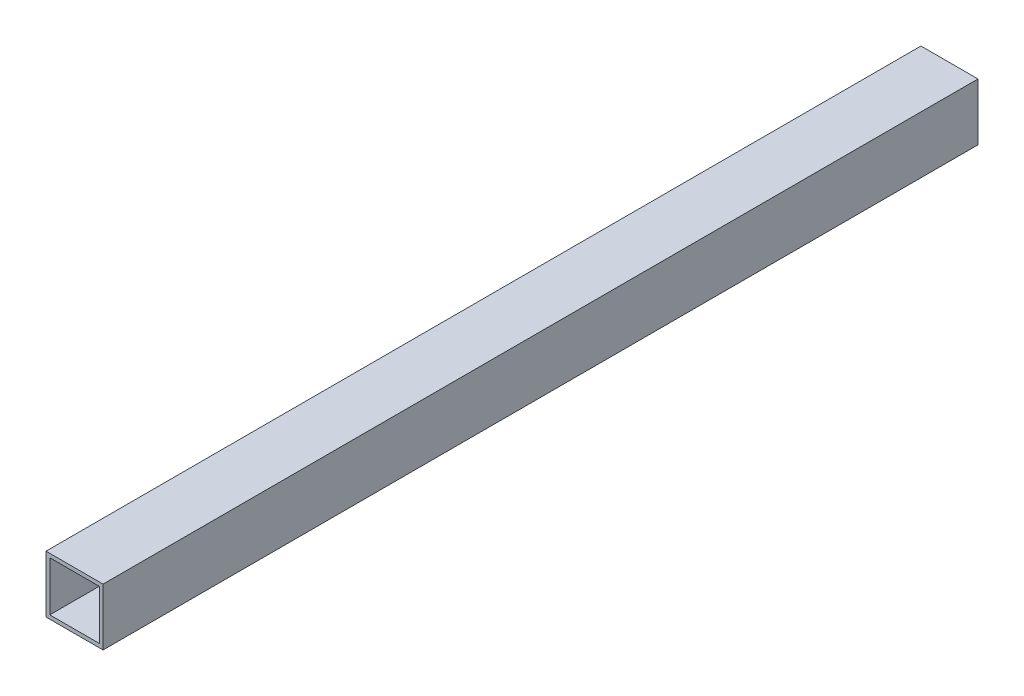
ISO-10303-21;
HEADER;
FILE_DESCRIPTION(('STEP AP214'),'2;1');
FILE_NAME('part.step','',(''),(''),'','','');
FILE_SCHEMA(('AUTOMOTIVE_DESIGN { 1 0 10303 214 1 1 1 1 }'));
ENDSEC;
DATA;
#1=APPLICATION_CONTEXT('core data for automotive mechanical design processes');
#2=APPLICATION_PROTOCOL_DEFINITION('international standard','automotive_design',2000,#1);
#3=PRODUCT_CONTEXT('',#1,'mechanical');
#4=PRODUCT('Part','Part','',(#3));
#5=PRODUCT_RELATED_PRODUCT_CATEGORY('part','',(#4));
#6=PRODUCT_DEFINITION_FORMATION('','',#4);
#7=PRODUCT_DEFINITION_CONTEXT('part definition',#1,'design');
#8=PRODUCT_DEFINITION('design','',#6,#7);
#9=PRODUCT_DEFINITION_SHAPE('','',#8);
#10=(LENGTH_UNIT() NAMED_UNIT(*) SI_UNIT(.MILLI.,.METRE.));
#11=(NAMED_UNIT(*) PLANE_ANGLE_UNIT() SI_UNIT($,.RADIAN.));
#12=(NAMED_UNIT(*) SI_UNIT($,.STERADIAN.) SOLID_ANGLE_UNIT());
#13=UNCERTAINTY_MEASURE_WITH_UNIT(LENGTH_MEASURE(1.E-05),#10,'distance_accuracy_value','');
#14=(GEOMETRIC_REPRESENTATION_CONTEXT(3) GLOBAL_UNCERTAINTY_ASSIGNED_CONTEXT((#13)) GLOBAL_UNIT_ASSIGNED_CONTEXT((#10,
#11,#12)) REPRESENTATION_CONTEXT('',''));
#15=CARTESIAN_POINT('',(0.,0.,0.));
#16=DIRECTION('',(0.,0.,1.));
#17=DIRECTION('',(1.,0.,0.));
#18=AXIS2_PLACEMENT_3D('',#15,#16,#17);
#19=CARTESIAN_POINT('',(-15.,-15.,460.));
#20=DIRECTION('',(0.,0.,1.));
#21=DIRECTION('',(1.,0.,0.));
#22=AXIS2_PLACEMENT_3D('',#19,#20,#21);
#23=PLANE('',#22);
#24=DIRECTION('',(0.,-1.,0.));
#25=VECTOR('',#24,1.);
#26=CARTESIAN_POINT('',(-15.,-15.,460.));
#27=LINE('',#26,#25);
#28=CARTESIAN_POINT('',(-15.,15.,460.));
#29=VERTEX_POINT('',#28);
#30=CARTESIAN_POINT('',(-15.,-15.,460.));
#31=VERTEX_POINT('',#30);
#32=EDGE_CURVE('E160',#29,#31,#27,.T.);
#33=ORIENTED_EDGE('',*,*,#32,.T.);
#34=DIRECTION('',(1.,0.,0.));
#35=VECTOR('',#34,1.);
#36=CARTESIAN_POINT('',(15.,-15.,460.));
#37=LINE('',#36,#35);
#38=CARTESIAN_POINT('',(15.,-15.,460.));
#39=VERTEX_POINT('',#38);
#40=EDGE_CURVE('E163',#31,#39,#37,.T.);
#41=ORIENTED_EDGE('',*,*,#40,.T.);
#42=DIRECTION('',(0.,1.,0.));
#43=VECTOR('',#42,1.);
#44=CARTESIAN_POINT('',(15.,-15.,460.));
#45=LINE('',#44,#43);
#46=CARTESIAN_POINT('',(15.,15.,460.));
#47=VERTEX_POINT('',#46);
#48=EDGE_CURVE('E166',#39,#47,#45,.T.);
#49=ORIENTED_EDGE('',*,*,#48,.T.);
#50=DIRECTION('',(-1.,0.,0.));
#51=VECTOR('',#50,1.);
#52=CARTESIAN_POINT('',(15.,15.,460.));
#53=LINE('',#52,#51);
#54=EDGE_CURVE('E168',#47,#29,#53,.T.);
#55=ORIENTED_EDGE('',*,*,#54,.T.);
#56=EDGE_LOOP('',(#33,#41,#49,#55));
#57=FACE_BOUND('',#56,.T.);
#58=DIRECTION('',(1.,0.,0.));
#59=VECTOR('',#58,1.);
#60=CARTESIAN_POINT('',(15.,-13.,460.));
#61=LINE('',#60,#59);
#62=CARTESIAN_POINT('',(-13.,-13.,460.));
#63=VERTEX_POINT('',#62);
#64=CARTESIAN_POINT('',(13.,-13.,460.));
#65=VERTEX_POINT('',#64);
#66=EDGE_CURVE('E132',#63,#65,#61,.T.);
#67=ORIENTED_EDGE('',*,*,#66,.F.);
#68=DIRECTION('',(0.,-1.,0.));
#69=VECTOR('',#68,1.);
#70=CARTESIAN_POINT('',(-13.,-15.,460.));
#71=LINE('',#70,#69);
#72=CARTESIAN_POINT('',(-13.,13.,460.));
#73=VERTEX_POINT('',#72);
#74=EDGE_CURVE('E124',#73,#63,#71,.T.);
#75=ORIENTED_EDGE('',*,*,#74,.F.);
#76=DIRECTION('',(-1.,0.,0.));
#77=VECTOR('',#76,1.);
#78=CARTESIAN_POINT('',(15.,13.,460.));
#79=LINE('',#78,#77);
#80=CARTESIAN_POINT('',(13.,13.,460.));
#81=VERTEX_POINT('',#80);
#82=EDGE_CURVE('E146',#81,#73,#79,.T.);
#83=ORIENTED_EDGE('',*,*,#82,.F.);
#84=DIRECTION('',(0.,1.,0.));
#85=VECTOR('',#84,1.);
#86=CARTESIAN_POINT('',(13.,-15.,460.));
#87=LINE('',#86,#85);
#88=EDGE_CURVE('E144',#65,#81,#87,.T.);
#89=ORIENTED_EDGE('',*,*,#88,.F.);
#90=EDGE_LOOP('',(#67,#75,#83,#89));
#91=FACE_BOUND('',#90,.T.);
#92=ADVANCED_FACE('F59',(#57,#91),#23,.T.);
#93=CARTESIAN_POINT('',(-15.,-15.,0.));
#94=DIRECTION('',(0.,0.,1.));
#95=DIRECTION('',(1.,0.,0.));
#96=AXIS2_PLACEMENT_3D('',#93,#94,#95);
#97=PLANE('',#96);
#98=DIRECTION('',(0.,-1.,0.));
#99=VECTOR('',#98,1.);
#100=CARTESIAN_POINT('',(-15.,-15.,0.));
#101=LINE('',#100,#99);
#102=CARTESIAN_POINT('',(-15.,15.,0.));
#103=VERTEX_POINT('',#102);
#104=CARTESIAN_POINT('',(-15.,-15.,0.));
#105=VERTEX_POINT('',#104);
#106=EDGE_CURVE('E140',#103,#105,#101,.T.);
#107=ORIENTED_EDGE('',*,*,#106,.F.);
#108=DIRECTION('',(-1.,0.,0.));
#109=VECTOR('',#108,1.);
#110=CARTESIAN_POINT('',(15.,15.,0.));
#111=LINE('',#110,#109);
#112=CARTESIAN_POINT('',(15.,15.,0.));
#113=VERTEX_POINT('',#112);
#114=EDGE_CURVE('E164',#113,#103,#111,.T.);
#115=ORIENTED_EDGE('',*,*,#114,.F.);
#116=DIRECTION('',(0.,1.,0.));
#117=VECTOR('',#116,1.);
#118=CARTESIAN_POINT('',(15.,-15.,0.));
#119=LINE('',#118,#117);
#120=CARTESIAN_POINT('',(15.,-15.,0.));
#121=VERTEX_POINT('',#120);
#122=EDGE_CURVE('E175',#121,#113,#119,.T.);
#123=ORIENTED_EDGE('',*,*,#122,.F.);
#124=DIRECTION('',(1.,0.,0.));
#125=VECTOR('',#124,1.);
#126=CARTESIAN_POINT('',(15.,-15.,0.));
#127=LINE('',#126,#125);
#128=EDGE_CURVE('E173',#105,#121,#127,.T.);
#129=ORIENTED_EDGE('',*,*,#128,.F.);
#130=EDGE_LOOP('',(#107,#115,#123,#129));
#131=FACE_BOUND('',#130,.T.);
#132=DIRECTION('',(0.,-1.,0.));
#133=VECTOR('',#132,1.);
#134=CARTESIAN_POINT('',(-13.,-15.,0.));
#135=LINE('',#134,#133);
#136=CARTESIAN_POINT('',(-13.,13.,0.));
#137=VERTEX_POINT('',#136);
#138=CARTESIAN_POINT('',(-13.,-13.,0.));
#139=VERTEX_POINT('',#138);
#140=EDGE_CURVE('E82',#137,#139,#135,.T.);
#141=ORIENTED_EDGE('',*,*,#140,.T.);
#142=DIRECTION('',(1.,0.,0.));
#143=VECTOR('',#142,1.);
#144=CARTESIAN_POINT('',(15.,-13.,0.));
#145=LINE('',#144,#143);
#146=CARTESIAN_POINT('',(13.,-13.,0.));
#147=VERTEX_POINT('',#146);
#148=EDGE_CURVE('E139',#139,#147,#145,.T.);
#149=ORIENTED_EDGE('',*,*,#148,.T.);
#150=DIRECTION('',(0.,1.,0.));
#151=VECTOR('',#150,1.);
#152=CARTESIAN_POINT('',(13.,-15.,0.));
#153=LINE('',#152,#151);
#154=CARTESIAN_POINT('',(13.,13.,0.));
#155=VERTEX_POINT('',#154);
#156=EDGE_CURVE('E152',#147,#155,#153,.T.);
#157=ORIENTED_EDGE('',*,*,#156,.T.);
#158=DIRECTION('',(-1.,0.,0.));
#159=VECTOR('',#158,1.);
#160=CARTESIAN_POINT('',(15.,13.,0.));
#161=LINE('',#160,#159);
#162=EDGE_CURVE('E133',#155,#137,#161,.T.);
#163=ORIENTED_EDGE('',*,*,#162,.T.);
#164=EDGE_LOOP('',(#141,#149,#157,#163));
#165=FACE_BOUND('',#164,.T.);
#166=ADVANCED_FACE('F193',(#131,#165),#97,.F.);
#167=CARTESIAN_POINT('',(-15.,-15.,460.));
#168=DIRECTION('',(1.,0.,0.));
#169=DIRECTION('',(0.,0.,-1.));
#170=AXIS2_PLACEMENT_3D('',#167,#168,#169);
#171=PLANE('',#170);
#172=ORIENTED_EDGE('',*,*,#106,.T.);
#173=DIRECTION('',(0.,0.,-1.));
#174=VECTOR('',#173,1.);
#175=CARTESIAN_POINT('',(-15.,-15.,460.));
#176=LINE('',#175,#174);
#177=EDGE_CURVE('E12',#31,#105,#176,.T.);
#178=ORIENTED_EDGE('',*,*,#177,.F.);
#179=ORIENTED_EDGE('',*,*,#32,.F.);
#180=DIRECTION('',(0.,0.,-1.));
#181=VECTOR('',#180,1.);
#182=CARTESIAN_POINT('',(-15.,15.,460.));
#183=LINE('',#182,#181);
#184=EDGE_CURVE('E170',#29,#103,#183,.T.);
#185=ORIENTED_EDGE('',*,*,#184,.T.);
#186=EDGE_LOOP('',(#172,#178,#179,#185));
#187=FACE_BOUND('',#186,.T.);
#188=ADVANCED_FACE('F61',(#187),#171,.F.);
#189=CARTESIAN_POINT('',(15.,-15.,460.));
#190=DIRECTION('',(0.,1.,0.));
#191=DIRECTION('',(0.,0.,1.));
#192=AXIS2_PLACEMENT_3D('',#189,#190,#191);
#193=PLANE('',#192);
#194=ORIENTED_EDGE('',*,*,#128,.T.);
#195=DIRECTION('',(0.,0.,-1.));
#196=VECTOR('',#195,1.);
#197=CARTESIAN_POINT('',(15.,-15.,460.));
#198=LINE('',#197,#196);
#199=EDGE_CURVE('E67',#39,#121,#198,.T.);
#200=ORIENTED_EDGE('',*,*,#199,.F.);
#201=ORIENTED_EDGE('',*,*,#40,.F.);
#202=ORIENTED_EDGE('',*,*,#177,.T.);
#203=EDGE_LOOP('',(#194,#200,#201,#202));
#204=FACE_BOUND('',#203,.T.);
#205=ADVANCED_FACE('F203',(#204),#193,.F.);
#206=CARTESIAN_POINT('',(15.,-15.,460.));
#207=DIRECTION('',(-1.,0.,0.));
#208=DIRECTION('',(0.,0.,1.));
#209=AXIS2_PLACEMENT_3D('',#206,#207,#208);
#210=PLANE('',#209);
#211=ORIENTED_EDGE('',*,*,#122,.T.);
#212=DIRECTION('',(0.,0.,-1.));
#213=VECTOR('',#212,1.);
#214=CARTESIAN_POINT('',(15.,15.,460.));
#215=LINE('',#214,#213);
#216=EDGE_CURVE('E180',#47,#113,#215,.T.);
#217=ORIENTED_EDGE('',*,*,#216,.F.);
#218=ORIENTED_EDGE('',*,*,#48,.F.);
#219=ORIENTED_EDGE('',*,*,#199,.T.);
#220=EDGE_LOOP('',(#211,#217,#218,#219));
#221=FACE_BOUND('',#220,.T.);
#222=ADVANCED_FACE('F187',(#221),#210,.F.);
#223=CARTESIAN_POINT('',(15.,15.,460.));
#224=DIRECTION('',(0.,-1.,0.));
#225=DIRECTION('',(1.,0.,0.));
#226=AXIS2_PLACEMENT_3D('',#223,#224,#225);
#227=PLANE('',#226);
#228=ORIENTED_EDGE('',*,*,#114,.T.);
#229=ORIENTED_EDGE('',*,*,#184,.F.);
#230=ORIENTED_EDGE('',*,*,#54,.F.);
#231=ORIENTED_EDGE('',*,*,#216,.T.);
#232=EDGE_LOOP('',(#228,#229,#230,#231));
#233=FACE_BOUND('',#232,.T.);
#234=ADVANCED_FACE('F197',(#233),#227,.F.);
#235=CARTESIAN_POINT('',(-13.,-15.,460.));
#236=DIRECTION('',(1.,0.,0.));
#237=DIRECTION('',(0.,0.,-1.));
#238=AXIS2_PLACEMENT_3D('',#235,#236,#237);
#239=PLANE('',#238);
#240=ORIENTED_EDGE('',*,*,#140,.F.);
#241=DIRECTION('',(0.,0.,-1.));
#242=VECTOR('',#241,1.);
#243=CARTESIAN_POINT('',(-13.,13.,460.));
#244=LINE('',#243,#242);
#245=EDGE_CURVE('E128',#73,#137,#244,.T.);
#246=ORIENTED_EDGE('',*,*,#245,.F.);
#247=ORIENTED_EDGE('',*,*,#74,.T.);
#248=DIRECTION('',(0.,0.,-1.));
#249=VECTOR('',#248,1.);
#250=CARTESIAN_POINT('',(-13.,-13.,460.));
#251=LINE('',#250,#249);
#252=EDGE_CURVE('E127',#63,#139,#251,.T.);
#253=ORIENTED_EDGE('',*,*,#252,.T.);
#254=EDGE_LOOP('',(#240,#246,#247,#253));
#255=FACE_BOUND('',#254,.T.);
#256=ADVANCED_FACE('F126',(#255),#239,.T.);
#257=CARTESIAN_POINT('',(15.,-13.,460.));
#258=DIRECTION('',(0.,1.,0.));
#259=DIRECTION('',(0.,0.,1.));
#260=AXIS2_PLACEMENT_3D('',#257,#258,#259);
#261=PLANE('',#260);
#262=ORIENTED_EDGE('',*,*,#148,.F.);
#263=ORIENTED_EDGE('',*,*,#252,.F.);
#264=ORIENTED_EDGE('',*,*,#66,.T.);
#265=DIRECTION('',(0.,0.,-1.));
#266=VECTOR('',#265,1.);
#267=CARTESIAN_POINT('',(13.,-13.,460.));
#268=LINE('',#267,#266);
#269=EDGE_CURVE('E141',#65,#147,#268,.T.);
#270=ORIENTED_EDGE('',*,*,#269,.T.);
#271=EDGE_LOOP('',(#262,#263,#264,#270));
#272=FACE_BOUND('',#271,.T.);
#273=ADVANCED_FACE('F136',(#272),#261,.T.);
#274=CARTESIAN_POINT('',(13.,-15.,460.));
#275=DIRECTION('',(-1.,0.,0.));
#276=DIRECTION('',(0.,0.,1.));
#277=AXIS2_PLACEMENT_3D('',#274,#275,#276);
#278=PLANE('',#277);
#279=ORIENTED_EDGE('',*,*,#156,.F.);
#280=ORIENTED_EDGE('',*,*,#269,.F.);
#281=ORIENTED_EDGE('',*,*,#88,.T.);
#282=DIRECTION('',(0.,0.,-1.));
#283=VECTOR('',#282,1.);
#284=CARTESIAN_POINT('',(13.,13.,460.));
#285=LINE('',#284,#283);
#286=EDGE_CURVE('E74',#81,#155,#285,.T.);
#287=ORIENTED_EDGE('',*,*,#286,.T.);
#288=EDGE_LOOP('',(#279,#280,#281,#287));
#289=FACE_BOUND('',#288,.T.);
#290=ADVANCED_FACE('F226',(#289),#278,.T.);
#291=CARTESIAN_POINT('',(15.,13.,460.));
#292=DIRECTION('',(0.,-1.,0.));
#293=DIRECTION('',(1.,0.,0.));
#294=AXIS2_PLACEMENT_3D('',#291,#292,#293);
#295=PLANE('',#294);
#296=ORIENTED_EDGE('',*,*,#162,.F.);
#297=ORIENTED_EDGE('',*,*,#286,.F.);
#298=ORIENTED_EDGE('',*,*,#82,.T.);
#299=ORIENTED_EDGE('',*,*,#245,.T.);
#300=EDGE_LOOP('',(#296,#297,#298,#299));
#301=FACE_BOUND('',#300,.T.);
#302=ADVANCED_FACE('F230',(#301),#295,.T.);
#303=CLOSED_SHELL('',(#92,#166,#188,#205,#222,#234,#256,#273,#290,#302));
#304=MANIFOLD_SOLID_BREP('B2',#303);
#305=ADVANCED_BREP_SHAPE_REPRESENTATION('',(#18,#304),#14);
#306=SHAPE_DEFINITION_REPRESENTATION(#9,#305);
ENDSEC;
END-ISO-10303-21;
